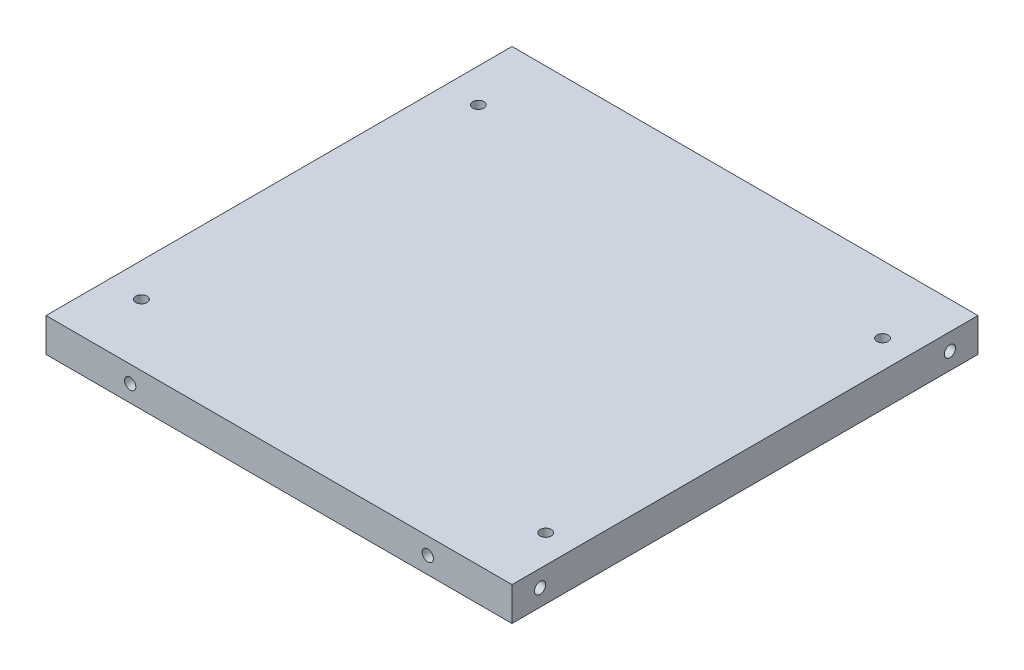
ISO-10303-21;
HEADER;
FILE_DESCRIPTION(('STEP AP214'),'2;1');
FILE_NAME('part.step','',(''),(''),'','','');
FILE_SCHEMA(('AUTOMOTIVE_DESIGN { 1 0 10303 214 1 1 1 1 }'));
ENDSEC;
DATA;
#1=APPLICATION_CONTEXT('core data for automotive mechanical design processes');
#2=APPLICATION_PROTOCOL_DEFINITION('international standard','automotive_design',2000,#1);
#3=PRODUCT_CONTEXT('',#1,'mechanical');
#4=PRODUCT('Part','Part','',(#3));
#5=PRODUCT_RELATED_PRODUCT_CATEGORY('part','',(#4));
#6=PRODUCT_DEFINITION_FORMATION('','',#4);
#7=PRODUCT_DEFINITION_CONTEXT('part definition',#1,'design');
#8=PRODUCT_DEFINITION('design','',#6,#7);
#9=PRODUCT_DEFINITION_SHAPE('','',#8);
#10=(LENGTH_UNIT() NAMED_UNIT(*) SI_UNIT(.MILLI.,.METRE.));
#11=(NAMED_UNIT(*) PLANE_ANGLE_UNIT() SI_UNIT($,.RADIAN.));
#12=(NAMED_UNIT(*) SI_UNIT($,.STERADIAN.) SOLID_ANGLE_UNIT());
#13=UNCERTAINTY_MEASURE_WITH_UNIT(LENGTH_MEASURE(1.E-05),#10,'distance_accuracy_value','');
#14=(GEOMETRIC_REPRESENTATION_CONTEXT(3) GLOBAL_UNCERTAINTY_ASSIGNED_CONTEXT((#13)) GLOBAL_UNIT_ASSIGNED_CONTEXT((#10,
#11,#12)) REPRESENTATION_CONTEXT('',''));
#15=CARTESIAN_POINT('',(0.,0.,0.));
#16=DIRECTION('',(0.,0.,1.));
#17=DIRECTION('',(1.,0.,0.));
#18=AXIS2_PLACEMENT_3D('',#15,#16,#17);
#19=CARTESIAN_POINT('',(78.,0.,-11.));
#20=DIRECTION('',(0.,1.,0.));
#21=DIRECTION('',(0.,0.,1.));
#22=AXIS2_PLACEMENT_3D('',#19,#20,#21);
#23=CYLINDRICAL_SURFACE('',#22,1.);
#24=CARTESIAN_POINT('',(78.,0.,-11.));
#25=DIRECTION('',(0.,1.,0.));
#26=DIRECTION('',(0.,0.,1.));
#27=AXIS2_PLACEMENT_3D('',#24,#25,#26);
#28=CIRCLE('',#27,1.);
#29=CARTESIAN_POINT('',(78.,0.,-10.));
#30=VERTEX_POINT('',#29);
#31=EDGE_CURVE('E43',#30,#30,#28,.T.);
#32=ORIENTED_EDGE('',*,*,#31,.F.);
#33=EDGE_LOOP('',(#32));
#34=FACE_BOUND('',#33,.T.);
#35=CARTESIAN_POINT('',(78.,6.,-11.));
#36=DIRECTION('',(0.,1.,0.));
#37=DIRECTION('',(0.,0.,1.));
#38=AXIS2_PLACEMENT_3D('',#35,#36,#37);
#39=CIRCLE('',#38,1.);
#40=CARTESIAN_POINT('',(78.,6.,-10.));
#41=VERTEX_POINT('',#40);
#42=EDGE_CURVE('E11',#41,#41,#39,.T.);
#43=ORIENTED_EDGE('',*,*,#42,.T.);
#44=EDGE_LOOP('',(#43));
#45=FACE_BOUND('',#44,.T.);
#46=ADVANCED_FACE('F35',(#34,#45),#23,.F.);
#47=CARTESIAN_POINT('',(6.00000000000001,0.,-11.));
#48=DIRECTION('',(0.,1.,0.));
#49=DIRECTION('',(0.,0.,1.));
#50=AXIS2_PLACEMENT_3D('',#47,#48,#49);
#51=CYLINDRICAL_SURFACE('',#50,1.);
#52=CARTESIAN_POINT('',(6.00000000000001,0.,-11.));
#53=DIRECTION('',(0.,1.,0.));
#54=DIRECTION('',(0.,0.,1.));
#55=AXIS2_PLACEMENT_3D('',#52,#53,#54);
#56=CIRCLE('',#55,1.);
#57=CARTESIAN_POINT('',(6.00000000000001,0.,-10.));
#58=VERTEX_POINT('',#57);
#59=EDGE_CURVE('E113',#58,#58,#56,.T.);
#60=ORIENTED_EDGE('',*,*,#59,.F.);
#61=EDGE_LOOP('',(#60));
#62=FACE_BOUND('',#61,.T.);
#63=CARTESIAN_POINT('',(6.00000000000001,6.,-11.));
#64=DIRECTION('',(0.,1.,0.));
#65=DIRECTION('',(0.,0.,1.));
#66=AXIS2_PLACEMENT_3D('',#63,#64,#65);
#67=CIRCLE('',#66,1.);
#68=CARTESIAN_POINT('',(6.00000000000001,6.,-10.));
#69=VERTEX_POINT('',#68);
#70=EDGE_CURVE('E116',#69,#69,#67,.T.);
#71=ORIENTED_EDGE('',*,*,#70,.T.);
#72=EDGE_LOOP('',(#71));
#73=FACE_BOUND('',#72,.T.);
#74=ADVANCED_FACE('F125',(#62,#73),#51,.F.);
#75=CARTESIAN_POINT('',(0.,6.,0.));
#76=DIRECTION('',(1.,0.,0.));
#77=DIRECTION('',(0.,0.,-1.));
#78=AXIS2_PLACEMENT_3D('',#75,#76,#77);
#79=PLANE('',#78);
#80=CARTESIAN_POINT('',(0.,3.,-78.));
#81=DIRECTION('',(-1.,0.,0.));
#82=DIRECTION('',(0.,0.,1.));
#83=AXIS2_PLACEMENT_3D('',#80,#81,#82);
#84=CIRCLE('',#83,0.999999999999998);
#85=CARTESIAN_POINT('',(0.,3.,-77.));
#86=VERTEX_POINT('',#85);
#87=EDGE_CURVE('E322',#86,#86,#84,.T.);
#88=ORIENTED_EDGE('',*,*,#87,.F.);
#89=EDGE_LOOP('',(#88));
#90=FACE_BOUND('',#89,.T.);
#91=CARTESIAN_POINT('',(0.,3.,-5.));
#92=DIRECTION('',(-1.,0.,0.));
#93=DIRECTION('',(0.,0.,1.));
#94=AXIS2_PLACEMENT_3D('',#91,#92,#93);
#95=CIRCLE('',#94,1.);
#96=CARTESIAN_POINT('',(0.,3.,-4.));
#97=VERTEX_POINT('',#96);
#98=EDGE_CURVE('E315',#97,#97,#95,.T.);
#99=ORIENTED_EDGE('',*,*,#98,.F.);
#100=EDGE_LOOP('',(#99));
#101=FACE_BOUND('',#100,.T.);
#102=DIRECTION('',(0.,0.,1.));
#103=VECTOR('',#102,1.);
#104=CARTESIAN_POINT('',(0.,0.,0.));
#105=LINE('',#104,#103);
#106=CARTESIAN_POINT('',(0.,0.,-83.));
#107=VERTEX_POINT('',#106);
#108=CARTESIAN_POINT('',(0.,0.,0.));
#109=VERTEX_POINT('',#108);
#110=EDGE_CURVE('E103',#107,#109,#105,.T.);
#111=ORIENTED_EDGE('',*,*,#110,.T.);
#112=DIRECTION('',(0.,-1.,0.));
#113=VECTOR('',#112,1.);
#114=CARTESIAN_POINT('',(0.,6.,0.));
#115=LINE('',#114,#113);
#116=CARTESIAN_POINT('',(0.,6.,0.));
#117=VERTEX_POINT('',#116);
#118=EDGE_CURVE('E94',#117,#109,#115,.T.);
#119=ORIENTED_EDGE('',*,*,#118,.F.);
#120=DIRECTION('',(0.,0.,1.));
#121=VECTOR('',#120,1.);
#122=CARTESIAN_POINT('',(0.,6.,0.));
#123=LINE('',#122,#121);
#124=CARTESIAN_POINT('',(0.,6.,-83.));
#125=VERTEX_POINT('',#124);
#126=EDGE_CURVE('E88',#125,#117,#123,.T.);
#127=ORIENTED_EDGE('',*,*,#126,.F.);
#128=DIRECTION('',(0.,-1.,0.));
#129=VECTOR('',#128,1.);
#130=CARTESIAN_POINT('',(0.,6.,-83.));
#131=LINE('',#130,#129);
#132=EDGE_CURVE('E99',#125,#107,#131,.T.);
#133=ORIENTED_EDGE('',*,*,#132,.T.);
#134=EDGE_LOOP('',(#111,#119,#127,#133));
#135=FACE_BOUND('',#134,.T.);
#136=ADVANCED_FACE('F152',(#90,#101,#135),#79,.F.);
#137=CARTESIAN_POINT('',(0.,6.,0.));
#138=DIRECTION('',(0.,0.,-1.));
#139=DIRECTION('',(-1.,0.,0.));
#140=AXIS2_PLACEMENT_3D('',#137,#138,#139);
#141=PLANE('',#140);
#142=CARTESIAN_POINT('',(15.,3.,0.));
#143=DIRECTION('',(0.,0.,1.));
#144=DIRECTION('',(1.,0.,0.));
#145=AXIS2_PLACEMENT_3D('',#142,#143,#144);
#146=CIRCLE('',#145,1.);
#147=CARTESIAN_POINT('',(16.,3.,0.));
#148=VERTEX_POINT('',#147);
#149=EDGE_CURVE('E346',#148,#148,#146,.T.);
#150=ORIENTED_EDGE('',*,*,#149,.F.);
#151=EDGE_LOOP('',(#150));
#152=FACE_BOUND('',#151,.T.);
#153=CARTESIAN_POINT('',(68.,3.,0.));
#154=DIRECTION('',(0.,0.,1.));
#155=DIRECTION('',(1.,0.,0.));
#156=AXIS2_PLACEMENT_3D('',#153,#154,#155);
#157=CIRCLE('',#156,0.999999999999998);
#158=CARTESIAN_POINT('',(69.,3.,0.));
#159=VERTEX_POINT('',#158);
#160=EDGE_CURVE('E339',#159,#159,#157,.T.);
#161=ORIENTED_EDGE('',*,*,#160,.F.);
#162=EDGE_LOOP('',(#161));
#163=FACE_BOUND('',#162,.T.);
#164=DIRECTION('',(1.,0.,0.));
#165=VECTOR('',#164,1.);
#166=CARTESIAN_POINT('',(0.,0.,0.));
#167=LINE('',#166,#165);
#168=CARTESIAN_POINT('',(83.,0.,0.));
#169=VERTEX_POINT('',#168);
#170=EDGE_CURVE('E93',#109,#169,#167,.T.);
#171=ORIENTED_EDGE('',*,*,#170,.T.);
#172=DIRECTION('',(0.,-1.,0.));
#173=VECTOR('',#172,1.);
#174=CARTESIAN_POINT('',(83.,6.,0.));
#175=LINE('',#174,#173);
#176=CARTESIAN_POINT('',(83.,6.,0.));
#177=VERTEX_POINT('',#176);
#178=EDGE_CURVE('E91',#177,#169,#175,.T.);
#179=ORIENTED_EDGE('',*,*,#178,.F.);
#180=DIRECTION('',(1.,0.,0.));
#181=VECTOR('',#180,1.);
#182=CARTESIAN_POINT('',(0.,6.,0.));
#183=LINE('',#182,#181);
#184=EDGE_CURVE('E82',#117,#177,#183,.T.);
#185=ORIENTED_EDGE('',*,*,#184,.F.);
#186=ORIENTED_EDGE('',*,*,#118,.T.);
#187=EDGE_LOOP('',(#171,#179,#185,#186));
#188=FACE_BOUND('',#187,.T.);
#189=ADVANCED_FACE('F92',(#152,#163,#188),#141,.F.);
#190=CARTESIAN_POINT('',(83.,6.,0.));
#191=DIRECTION('',(-1.,0.,0.));
#192=DIRECTION('',(0.,0.,1.));
#193=AXIS2_PLACEMENT_3D('',#190,#191,#192);
#194=PLANE('',#193);
#195=CARTESIAN_POINT('',(83.,3.,-78.));
#196=DIRECTION('',(-1.,0.,0.));
#197=DIRECTION('',(0.,0.,1.));
#198=AXIS2_PLACEMENT_3D('',#195,#196,#197);
#199=CIRCLE('',#198,0.999999999999998);
#200=CARTESIAN_POINT('',(83.,3.,-77.));
#201=VERTEX_POINT('',#200);
#202=EDGE_CURVE('E334',#201,#201,#199,.T.);
#203=ORIENTED_EDGE('',*,*,#202,.T.);
#204=EDGE_LOOP('',(#203));
#205=FACE_BOUND('',#204,.T.);
#206=CARTESIAN_POINT('',(83.,3.,-5.));
#207=DIRECTION('',(-1.,0.,0.));
#208=DIRECTION('',(0.,0.,1.));
#209=AXIS2_PLACEMENT_3D('',#206,#207,#208);
#210=CIRCLE('',#209,1.);
#211=CARTESIAN_POINT('',(83.,3.,-4.));
#212=VERTEX_POINT('',#211);
#213=EDGE_CURVE('E327',#212,#212,#210,.T.);
#214=ORIENTED_EDGE('',*,*,#213,.T.);
#215=EDGE_LOOP('',(#214));
#216=FACE_BOUND('',#215,.T.);
#217=DIRECTION('',(0.,0.,-1.));
#218=VECTOR('',#217,1.);
#219=CARTESIAN_POINT('',(83.,0.,0.));
#220=LINE('',#219,#218);
#221=CARTESIAN_POINT('',(83.,0.,-83.));
#222=VERTEX_POINT('',#221);
#223=EDGE_CURVE('E68',#169,#222,#220,.T.);
#224=ORIENTED_EDGE('',*,*,#223,.T.);
#225=DIRECTION('',(0.,-1.,0.));
#226=VECTOR('',#225,1.);
#227=CARTESIAN_POINT('',(83.,6.,-83.));
#228=LINE('',#227,#226);
#229=CARTESIAN_POINT('',(83.,6.,-83.));
#230=VERTEX_POINT('',#229);
#231=EDGE_CURVE('E95',#230,#222,#228,.T.);
#232=ORIENTED_EDGE('',*,*,#231,.F.);
#233=DIRECTION('',(0.,0.,-1.));
#234=VECTOR('',#233,1.);
#235=CARTESIAN_POINT('',(83.,6.,0.));
#236=LINE('',#235,#234);
#237=EDGE_CURVE('E86',#177,#230,#236,.T.);
#238=ORIENTED_EDGE('',*,*,#237,.F.);
#239=ORIENTED_EDGE('',*,*,#178,.T.);
#240=EDGE_LOOP('',(#224,#232,#238,#239));
#241=FACE_BOUND('',#240,.T.);
#242=ADVANCED_FACE('F97',(#205,#216,#241),#194,.F.);
#243=CARTESIAN_POINT('',(0.,6.,-83.));
#244=DIRECTION('',(0.,0.,1.));
#245=DIRECTION('',(1.,0.,0.));
#246=AXIS2_PLACEMENT_3D('',#243,#244,#245);
#247=PLANE('',#246);
#248=CARTESIAN_POINT('',(15.,3.,-83.));
#249=DIRECTION('',(0.,0.,1.));
#250=DIRECTION('',(1.,0.,0.));
#251=AXIS2_PLACEMENT_3D('',#248,#249,#250);
#252=CIRCLE('',#251,1.);
#253=CARTESIAN_POINT('',(16.,3.,-83.));
#254=VERTEX_POINT('',#253);
#255=EDGE_CURVE('E357',#254,#254,#252,.T.);
#256=ORIENTED_EDGE('',*,*,#255,.T.);
#257=EDGE_LOOP('',(#256));
#258=FACE_BOUND('',#257,.T.);
#259=CARTESIAN_POINT('',(68.,3.,-83.));
#260=DIRECTION('',(0.,0.,1.));
#261=DIRECTION('',(1.,0.,0.));
#262=AXIS2_PLACEMENT_3D('',#259,#260,#261);
#263=CIRCLE('',#262,0.999999999999998);
#264=CARTESIAN_POINT('',(69.,3.,-83.));
#265=VERTEX_POINT('',#264);
#266=EDGE_CURVE('E351',#265,#265,#263,.T.);
#267=ORIENTED_EDGE('',*,*,#266,.T.);
#268=EDGE_LOOP('',(#267));
#269=FACE_BOUND('',#268,.T.);
#270=DIRECTION('',(-1.,0.,0.));
#271=VECTOR('',#270,1.);
#272=CARTESIAN_POINT('',(0.,0.,-83.));
#273=LINE('',#272,#271);
#274=EDGE_CURVE('E74',#222,#107,#273,.T.);
#275=ORIENTED_EDGE('',*,*,#274,.T.);
#276=ORIENTED_EDGE('',*,*,#132,.F.);
#277=DIRECTION('',(-1.,0.,0.));
#278=VECTOR('',#277,1.);
#279=CARTESIAN_POINT('',(0.,6.,-83.));
#280=LINE('',#279,#278);
#281=EDGE_CURVE('E51',#230,#125,#280,.T.);
#282=ORIENTED_EDGE('',*,*,#281,.F.);
#283=ORIENTED_EDGE('',*,*,#231,.T.);
#284=EDGE_LOOP('',(#275,#276,#282,#283));
#285=FACE_BOUND('',#284,.T.);
#286=ADVANCED_FACE('F129',(#258,#269,#285),#247,.F.);
#287=CARTESIAN_POINT('',(0.,6.,0.));
#288=DIRECTION('',(0.,-1.,0.));
#289=DIRECTION('',(0.,0.,-1.));
#290=AXIS2_PLACEMENT_3D('',#287,#288,#289);
#291=PLANE('',#290);
#292=CARTESIAN_POINT('',(78.,6.,-71.));
#293=DIRECTION('',(0.,1.,0.));
#294=DIRECTION('',(0.,0.,1.));
#295=AXIS2_PLACEMENT_3D('',#292,#293,#294);
#296=CIRCLE('',#295,1.);
#297=CARTESIAN_POINT('',(78.,6.,-70.));
#298=VERTEX_POINT('',#297);
#299=EDGE_CURVE('E298',#298,#298,#296,.T.);
#300=ORIENTED_EDGE('',*,*,#299,.F.);
#301=EDGE_LOOP('',(#300));
#302=FACE_BOUND('',#301,.T.);
#303=CARTESIAN_POINT('',(6.,6.,-71.));
#304=DIRECTION('',(0.,1.,0.));
#305=DIRECTION('',(0.,0.,1.));
#306=AXIS2_PLACEMENT_3D('',#303,#304,#305);
#307=CIRCLE('',#306,1.);
#308=CARTESIAN_POINT('',(6.,6.,-70.));
#309=VERTEX_POINT('',#308);
#310=EDGE_CURVE('E299',#309,#309,#307,.T.);
#311=ORIENTED_EDGE('',*,*,#310,.F.);
#312=EDGE_LOOP('',(#311));
#313=FACE_BOUND('',#312,.T.);
#314=ORIENTED_EDGE('',*,*,#126,.T.);
#315=ORIENTED_EDGE('',*,*,#184,.T.);
#316=ORIENTED_EDGE('',*,*,#237,.T.);
#317=ORIENTED_EDGE('',*,*,#281,.T.);
#318=EDGE_LOOP('',(#314,#315,#316,#317));
#319=FACE_BOUND('',#318,.T.);
#320=ORIENTED_EDGE('',*,*,#70,.F.);
#321=EDGE_LOOP('',(#320));
#322=FACE_BOUND('',#321,.T.);
#323=ORIENTED_EDGE('',*,*,#42,.F.);
#324=EDGE_LOOP('',(#323));
#325=FACE_BOUND('',#324,.T.);
#326=ADVANCED_FACE('F83',(#302,#313,#319,#322,#325),#291,.F.);
#327=CARTESIAN_POINT('',(0.,0.,0.));
#328=DIRECTION('',(0.,-1.,0.));
#329=DIRECTION('',(0.,0.,-1.));
#330=AXIS2_PLACEMENT_3D('',#327,#328,#329);
#331=PLANE('',#330);
#332=CARTESIAN_POINT('',(78.,0.,-71.));
#333=DIRECTION('',(0.,1.,0.));
#334=DIRECTION('',(0.,0.,1.));
#335=AXIS2_PLACEMENT_3D('',#332,#333,#334);
#336=CIRCLE('',#335,1.);
#337=CARTESIAN_POINT('',(78.,0.,-70.));
#338=VERTEX_POINT('',#337);
#339=EDGE_CURVE('E296',#338,#338,#336,.T.);
#340=ORIENTED_EDGE('',*,*,#339,.T.);
#341=EDGE_LOOP('',(#340));
#342=FACE_BOUND('',#341,.T.);
#343=CARTESIAN_POINT('',(6.,0.,-71.));
#344=DIRECTION('',(0.,1.,0.));
#345=DIRECTION('',(0.,0.,1.));
#346=AXIS2_PLACEMENT_3D('',#343,#344,#345);
#347=CIRCLE('',#346,1.);
#348=CARTESIAN_POINT('',(6.,0.,-70.));
#349=VERTEX_POINT('',#348);
#350=EDGE_CURVE('E106',#349,#349,#347,.T.);
#351=ORIENTED_EDGE('',*,*,#350,.T.);
#352=EDGE_LOOP('',(#351));
#353=FACE_BOUND('',#352,.T.);
#354=ORIENTED_EDGE('',*,*,#110,.F.);
#355=ORIENTED_EDGE('',*,*,#274,.F.);
#356=ORIENTED_EDGE('',*,*,#223,.F.);
#357=ORIENTED_EDGE('',*,*,#170,.F.);
#358=EDGE_LOOP('',(#354,#355,#356,#357));
#359=FACE_BOUND('',#358,.T.);
#360=ORIENTED_EDGE('',*,*,#59,.T.);
#361=EDGE_LOOP('',(#360));
#362=FACE_BOUND('',#361,.T.);
#363=ORIENTED_EDGE('',*,*,#31,.T.);
#364=EDGE_LOOP('',(#363));
#365=FACE_BOUND('',#364,.T.);
#366=ADVANCED_FACE('F121',(#342,#353,#359,#362,#365),#331,.T.);
#367=CARTESIAN_POINT('',(6.,0.,-71.));
#368=DIRECTION('',(0.,1.,0.));
#369=DIRECTION('',(0.,0.,1.));
#370=AXIS2_PLACEMENT_3D('',#367,#368,#369);
#371=CYLINDRICAL_SURFACE('',#370,1.);
#372=ORIENTED_EDGE('',*,*,#350,.F.);
#373=EDGE_LOOP('',(#372));
#374=FACE_BOUND('',#373,.T.);
#375=ORIENTED_EDGE('',*,*,#310,.T.);
#376=EDGE_LOOP('',(#375));
#377=FACE_BOUND('',#376,.T.);
#378=ADVANCED_FACE('F136',(#374,#377),#371,.F.);
#379=CARTESIAN_POINT('',(78.,0.,-71.));
#380=DIRECTION('',(0.,1.,0.));
#381=DIRECTION('',(0.,0.,1.));
#382=AXIS2_PLACEMENT_3D('',#379,#380,#381);
#383=CYLINDRICAL_SURFACE('',#382,1.);
#384=ORIENTED_EDGE('',*,*,#339,.F.);
#385=EDGE_LOOP('',(#384));
#386=FACE_BOUND('',#385,.T.);
#387=ORIENTED_EDGE('',*,*,#299,.T.);
#388=EDGE_LOOP('',(#387));
#389=FACE_BOUND('',#388,.T.);
#390=ADVANCED_FACE('F286',(#386,#389),#383,.F.);
#391=CARTESIAN_POINT('',(10.,3.,-5.));
#392=DIRECTION('',(-1.,0.,0.));
#393=DIRECTION('',(0.,0.,1.));
#394=AXIS2_PLACEMENT_3D('',#391,#392,#393);
#395=CYLINDRICAL_SURFACE('',#394,1.);
#396=CARTESIAN_POINT('',(10.,3.,-5.));
#397=DIRECTION('',(-1.,0.,0.));
#398=DIRECTION('',(0.,0.,1.));
#399=AXIS2_PLACEMENT_3D('',#396,#397,#398);
#400=CIRCLE('',#399,1.);
#401=CARTESIAN_POINT('',(10.,3.,-4.));
#402=VERTEX_POINT('',#401);
#403=EDGE_CURVE('E318',#402,#402,#400,.T.);
#404=ORIENTED_EDGE('',*,*,#403,.F.);
#405=EDGE_LOOP('',(#404));
#406=FACE_BOUND('',#405,.T.);
#407=ORIENTED_EDGE('',*,*,#98,.T.);
#408=EDGE_LOOP('',(#407));
#409=FACE_BOUND('',#408,.T.);
#410=ADVANCED_FACE('F283',(#406,#409),#395,.F.);
#411=CARTESIAN_POINT('',(10.,3.,-5.));
#412=DIRECTION('',(-1.,0.,0.));
#413=DIRECTION('',(0.,0.,1.));
#414=AXIS2_PLACEMENT_3D('',#411,#412,#413);
#415=PLANE('',#414);
#416=ORIENTED_EDGE('',*,*,#403,.T.);
#417=EDGE_LOOP('',(#416));
#418=FACE_BOUND('',#417,.T.);
#419=ADVANCED_FACE('F279',(#418),#415,.T.);
#420=CARTESIAN_POINT('',(10.,3.,-78.));
#421=DIRECTION('',(-1.,0.,0.));
#422=DIRECTION('',(0.,0.,1.));
#423=AXIS2_PLACEMENT_3D('',#420,#421,#422);
#424=CYLINDRICAL_SURFACE('',#423,0.999999999999998);
#425=CARTESIAN_POINT('',(10.,3.,-78.));
#426=DIRECTION('',(-1.,0.,0.));
#427=DIRECTION('',(0.,0.,1.));
#428=AXIS2_PLACEMENT_3D('',#425,#426,#427);
#429=CIRCLE('',#428,0.999999999999998);
#430=CARTESIAN_POINT('',(10.,3.,-77.));
#431=VERTEX_POINT('',#430);
#432=EDGE_CURVE('E303',#431,#431,#429,.T.);
#433=ORIENTED_EDGE('',*,*,#432,.F.);
#434=EDGE_LOOP('',(#433));
#435=FACE_BOUND('',#434,.T.);
#436=ORIENTED_EDGE('',*,*,#87,.T.);
#437=EDGE_LOOP('',(#436));
#438=FACE_BOUND('',#437,.T.);
#439=ADVANCED_FACE('F275',(#435,#438),#424,.F.);
#440=CARTESIAN_POINT('',(10.,3.,-78.));
#441=DIRECTION('',(-1.,0.,0.));
#442=DIRECTION('',(0.,0.,1.));
#443=AXIS2_PLACEMENT_3D('',#440,#441,#442);
#444=PLANE('',#443);
#445=ORIENTED_EDGE('',*,*,#432,.T.);
#446=EDGE_LOOP('',(#445));
#447=FACE_BOUND('',#446,.T.);
#448=ADVANCED_FACE('F271',(#447),#444,.T.);
#449=CARTESIAN_POINT('',(73.,3.,-5.));
#450=DIRECTION('',(1.,0.,0.));
#451=DIRECTION('',(0.,0.,-1.));
#452=AXIS2_PLACEMENT_3D('',#449,#450,#451);
#453=CYLINDRICAL_SURFACE('',#452,1.);
#454=CARTESIAN_POINT('',(73.,3.,-5.));
#455=DIRECTION('',(-1.,0.,0.));
#456=DIRECTION('',(0.,0.,1.));
#457=AXIS2_PLACEMENT_3D('',#454,#455,#456);
#458=CIRCLE('',#457,1.);
#459=CARTESIAN_POINT('',(73.,3.,-4.));
#460=VERTEX_POINT('',#459);
#461=EDGE_CURVE('E330',#460,#460,#458,.T.);
#462=ORIENTED_EDGE('',*,*,#461,.T.);
#463=EDGE_LOOP('',(#462));
#464=FACE_BOUND('',#463,.T.);
#465=ORIENTED_EDGE('',*,*,#213,.F.);
#466=EDGE_LOOP('',(#465));
#467=FACE_BOUND('',#466,.T.);
#468=ADVANCED_FACE('F267',(#464,#467),#453,.F.);
#469=CARTESIAN_POINT('',(73.,3.,-5.));
#470=DIRECTION('',(1.,0.,0.));
#471=DIRECTION('',(0.,0.,1.));
#472=AXIS2_PLACEMENT_3D('',#469,#470,#471);
#473=PLANE('',#472);
#474=ORIENTED_EDGE('',*,*,#461,.F.);
#475=EDGE_LOOP('',(#474));
#476=FACE_BOUND('',#475,.T.);
#477=ADVANCED_FACE('F263',(#476),#473,.T.);
#478=CARTESIAN_POINT('',(73.,3.,-78.));
#479=DIRECTION('',(1.,0.,0.));
#480=DIRECTION('',(0.,0.,-1.));
#481=AXIS2_PLACEMENT_3D('',#478,#479,#480);
#482=CYLINDRICAL_SURFACE('',#481,0.999999999999998);
#483=CARTESIAN_POINT('',(73.,3.,-78.));
#484=DIRECTION('',(-1.,0.,0.));
#485=DIRECTION('',(0.,0.,1.));
#486=AXIS2_PLACEMENT_3D('',#483,#484,#485);
#487=CIRCLE('',#486,0.999999999999998);
#488=CARTESIAN_POINT('',(73.,3.,-77.));
#489=VERTEX_POINT('',#488);
#490=EDGE_CURVE('E319',#489,#489,#487,.T.);
#491=ORIENTED_EDGE('',*,*,#490,.T.);
#492=EDGE_LOOP('',(#491));
#493=FACE_BOUND('',#492,.T.);
#494=ORIENTED_EDGE('',*,*,#202,.F.);
#495=EDGE_LOOP('',(#494));
#496=FACE_BOUND('',#495,.T.);
#497=ADVANCED_FACE('F259',(#493,#496),#482,.F.);
#498=CARTESIAN_POINT('',(73.,3.,-78.));
#499=DIRECTION('',(1.,0.,0.));
#500=DIRECTION('',(0.,0.,1.));
#501=AXIS2_PLACEMENT_3D('',#498,#499,#500);
#502=PLANE('',#501);
#503=ORIENTED_EDGE('',*,*,#490,.F.);
#504=EDGE_LOOP('',(#503));
#505=FACE_BOUND('',#504,.T.);
#506=ADVANCED_FACE('F255',(#505),#502,.T.);
#507=CARTESIAN_POINT('',(68.,3.,-10.));
#508=DIRECTION('',(0.,0.,1.));
#509=DIRECTION('',(1.,0.,0.));
#510=AXIS2_PLACEMENT_3D('',#507,#508,#509);
#511=CYLINDRICAL_SURFACE('',#510,0.999999999999998);
#512=CARTESIAN_POINT('',(68.,3.,-10.));
#513=DIRECTION('',(0.,0.,1.));
#514=DIRECTION('',(1.,0.,0.));
#515=AXIS2_PLACEMENT_3D('',#512,#513,#514);
#516=CIRCLE('',#515,0.999999999999998);
#517=CARTESIAN_POINT('',(69.,3.,-10.));
#518=VERTEX_POINT('',#517);
#519=EDGE_CURVE('E342',#518,#518,#516,.T.);
#520=ORIENTED_EDGE('',*,*,#519,.F.);
#521=EDGE_LOOP('',(#520));
#522=FACE_BOUND('',#521,.T.);
#523=ORIENTED_EDGE('',*,*,#160,.T.);
#524=EDGE_LOOP('',(#523));
#525=FACE_BOUND('',#524,.T.);
#526=ADVANCED_FACE('F251',(#522,#525),#511,.F.);
#527=CARTESIAN_POINT('',(68.,3.,-10.));
#528=DIRECTION('',(0.,0.,1.));
#529=DIRECTION('',(1.,0.,0.));
#530=AXIS2_PLACEMENT_3D('',#527,#528,#529);
#531=PLANE('',#530);
#532=ORIENTED_EDGE('',*,*,#519,.T.);
#533=EDGE_LOOP('',(#532));
#534=FACE_BOUND('',#533,.T.);
#535=ADVANCED_FACE('F247',(#534),#531,.T.);
#536=CARTESIAN_POINT('',(15.,3.,-10.));
#537=DIRECTION('',(0.,0.,1.));
#538=DIRECTION('',(1.,0.,0.));
#539=AXIS2_PLACEMENT_3D('',#536,#537,#538);
#540=CYLINDRICAL_SURFACE('',#539,1.);
#541=CARTESIAN_POINT('',(15.,3.,-10.));
#542=DIRECTION('',(0.,0.,1.));
#543=DIRECTION('',(1.,0.,0.));
#544=AXIS2_PLACEMENT_3D('',#541,#542,#543);
#545=CIRCLE('',#544,1.);
#546=CARTESIAN_POINT('',(16.,3.,-10.));
#547=VERTEX_POINT('',#546);
#548=EDGE_CURVE('E331',#547,#547,#545,.T.);
#549=ORIENTED_EDGE('',*,*,#548,.F.);
#550=EDGE_LOOP('',(#549));
#551=FACE_BOUND('',#550,.T.);
#552=ORIENTED_EDGE('',*,*,#149,.T.);
#553=EDGE_LOOP('',(#552));
#554=FACE_BOUND('',#553,.T.);
#555=ADVANCED_FACE('F243',(#551,#554),#540,.F.);
#556=CARTESIAN_POINT('',(15.,3.,-10.));
#557=DIRECTION('',(0.,0.,1.));
#558=DIRECTION('',(1.,0.,0.));
#559=AXIS2_PLACEMENT_3D('',#556,#557,#558);
#560=PLANE('',#559);
#561=ORIENTED_EDGE('',*,*,#548,.T.);
#562=EDGE_LOOP('',(#561));
#563=FACE_BOUND('',#562,.T.);
#564=ADVANCED_FACE('F196',(#563),#560,.T.);
#565=CARTESIAN_POINT('',(68.,3.,-73.));
#566=DIRECTION('',(0.,0.,-1.));
#567=DIRECTION('',(-1.,0.,0.));
#568=AXIS2_PLACEMENT_3D('',#565,#566,#567);
#569=CYLINDRICAL_SURFACE('',#568,0.999999999999998);
#570=CARTESIAN_POINT('',(68.,3.,-73.));
#571=DIRECTION('',(0.,0.,1.));
#572=DIRECTION('',(1.,0.,0.));
#573=AXIS2_PLACEMENT_3D('',#570,#571,#572);
#574=CIRCLE('',#573,0.999999999999998);
#575=CARTESIAN_POINT('',(69.,3.,-73.));
#576=VERTEX_POINT('',#575);
#577=EDGE_CURVE('E354',#576,#576,#574,.T.);
#578=ORIENTED_EDGE('',*,*,#577,.T.);
#579=EDGE_LOOP('',(#578));
#580=FACE_BOUND('',#579,.T.);
#581=ORIENTED_EDGE('',*,*,#266,.F.);
#582=EDGE_LOOP('',(#581));
#583=FACE_BOUND('',#582,.T.);
#584=ADVANCED_FACE('F201',(#580,#583),#569,.F.);
#585=CARTESIAN_POINT('',(68.,3.,-73.));
#586=DIRECTION('',(0.,0.,-1.));
#587=DIRECTION('',(1.,0.,0.));
#588=AXIS2_PLACEMENT_3D('',#585,#586,#587);
#589=PLANE('',#588);
#590=ORIENTED_EDGE('',*,*,#577,.F.);
#591=EDGE_LOOP('',(#590));
#592=FACE_BOUND('',#591,.T.);
#593=ADVANCED_FACE('F206',(#592),#589,.T.);
#594=CARTESIAN_POINT('',(15.,3.,-73.));
#595=DIRECTION('',(0.,0.,-1.));
#596=DIRECTION('',(-1.,0.,0.));
#597=AXIS2_PLACEMENT_3D('',#594,#595,#596);
#598=CYLINDRICAL_SURFACE('',#597,1.);
#599=CARTESIAN_POINT('',(15.,3.,-73.));
#600=DIRECTION('',(0.,0.,1.));
#601=DIRECTION('',(1.,0.,0.));
#602=AXIS2_PLACEMENT_3D('',#599,#600,#601);
#603=CIRCLE('',#602,1.);
#604=CARTESIAN_POINT('',(16.,3.,-73.));
#605=VERTEX_POINT('',#604);
#606=EDGE_CURVE('E343',#605,#605,#603,.T.);
#607=ORIENTED_EDGE('',*,*,#606,.T.);
#608=EDGE_LOOP('',(#607));
#609=FACE_BOUND('',#608,.T.);
#610=ORIENTED_EDGE('',*,*,#255,.F.);
#611=EDGE_LOOP('',(#610));
#612=FACE_BOUND('',#611,.T.);
#613=ADVANCED_FACE('F216',(#609,#612),#598,.F.);
#614=CARTESIAN_POINT('',(15.,3.,-73.));
#615=DIRECTION('',(0.,0.,-1.));
#616=DIRECTION('',(1.,0.,0.));
#617=AXIS2_PLACEMENT_3D('',#614,#615,#616);
#618=PLANE('',#617);
#619=ORIENTED_EDGE('',*,*,#606,.F.);
#620=EDGE_LOOP('',(#619));
#621=FACE_BOUND('',#620,.T.);
#622=ADVANCED_FACE('F226',(#621),#618,.T.);
#623=CLOSED_SHELL('',(#46,#74,#136,#189,#242,#286,#326,#366,#378,#390,#410,#419,#439,#448,#468,
#477,#497,#506,#526,#535,#555,#564,#584,#593,#613,#622));
#624=MANIFOLD_SOLID_BREP('B2',#623);
#625=ADVANCED_BREP_SHAPE_REPRESENTATION('',(#18,#624),#14);
#626=SHAPE_DEFINITION_REPRESENTATION(#9,#625);
ENDSEC;
END-ISO-10303-21;
